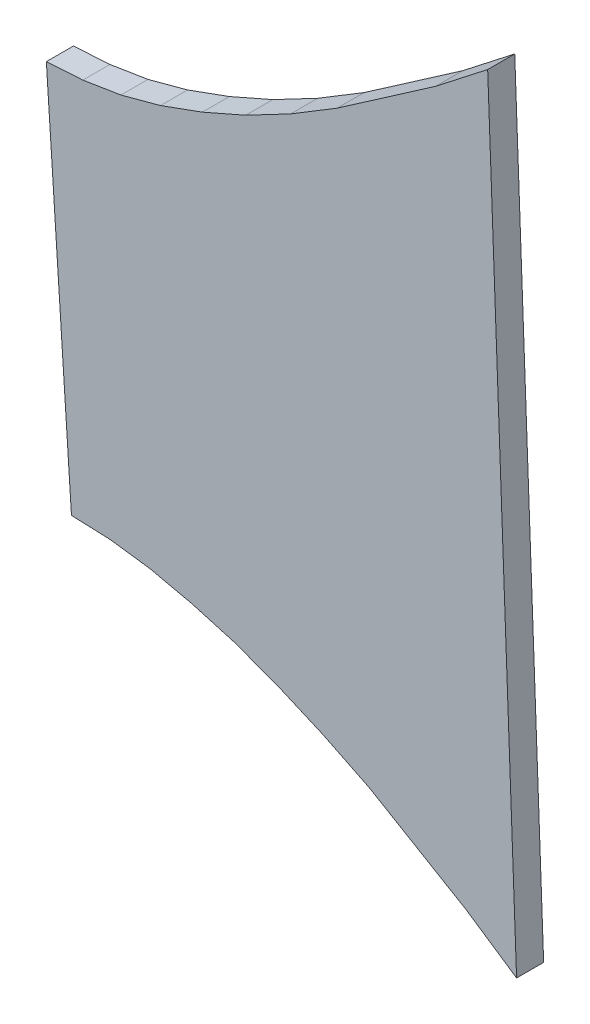
ISO-10303-21;
HEADER;
FILE_DESCRIPTION(('STEP AP214'),'2;1');
FILE_NAME('part.step','',(''),(''),'','','');
FILE_SCHEMA(('AUTOMOTIVE_DESIGN { 1 0 10303 214 1 1 1 1 }'));
ENDSEC;
DATA;
#1=APPLICATION_CONTEXT('core data for automotive mechanical design processes');
#2=APPLICATION_PROTOCOL_DEFINITION('international standard','automotive_design',2000,#1);
#3=PRODUCT_CONTEXT('',#1,'mechanical');
#4=PRODUCT('Part','Part','',(#3));
#5=PRODUCT_RELATED_PRODUCT_CATEGORY('part','',(#4));
#6=PRODUCT_DEFINITION_FORMATION('','',#4);
#7=PRODUCT_DEFINITION_CONTEXT('part definition',#1,'design');
#8=PRODUCT_DEFINITION('design','',#6,#7);
#9=PRODUCT_DEFINITION_SHAPE('','',#8);
#10=(LENGTH_UNIT() NAMED_UNIT(*) SI_UNIT(.MILLI.,.METRE.));
#11=(NAMED_UNIT(*) PLANE_ANGLE_UNIT() SI_UNIT($,.RADIAN.));
#12=(NAMED_UNIT(*) SI_UNIT($,.STERADIAN.) SOLID_ANGLE_UNIT());
#13=UNCERTAINTY_MEASURE_WITH_UNIT(LENGTH_MEASURE(1.E-05),#10,'distance_accuracy_value','');
#14=(GEOMETRIC_REPRESENTATION_CONTEXT(3) GLOBAL_UNCERTAINTY_ASSIGNED_CONTEXT((#13)) GLOBAL_UNIT_ASSIGNED_CONTEXT((#10,
#11,#12)) REPRESENTATION_CONTEXT('',''));
#15=CARTESIAN_POINT('',(0.,0.,0.));
#16=DIRECTION('',(0.,0.,1.));
#17=DIRECTION('',(1.,0.,0.));
#18=AXIS2_PLACEMENT_3D('',#15,#16,#17);
#19=CARTESIAN_POINT('',(55.9529991149902,97.7119979858398,0.));
#20=DIRECTION('',(0.0391621558048057,0.999232868531015,0.));
#21=DIRECTION('',(0.999232868531015,-0.0391621558048057,0.));
#22=AXIS2_PLACEMENT_3D('',#19,#20,#21);
#23=PLANE('',#22);
#24=DIRECTION('',(0.999232868531015,-0.0391621558048057,0.));
#25=VECTOR('',#24,1.);
#26=CARTESIAN_POINT('',(55.9529991149902,97.7119979858398,0.03556));
#27=LINE('',#26,#25);
#28=CARTESIAN_POINT('',(55.9529991149902,97.7119979858398,0.03556));
#29=VERTEX_POINT('',#28);
#30=CARTESIAN_POINT('',(56.0040016174316,97.7099990844727,0.03556));
#31=VERTEX_POINT('',#30);
#32=EDGE_CURVE('E11',#29,#31,#27,.T.);
#33=ORIENTED_EDGE('',*,*,#32,.F.);
#34=DIRECTION('',(0.,0.,1.));
#35=VECTOR('',#34,1.);
#36=CARTESIAN_POINT('',(55.9529991149902,97.7119979858398,0.));
#37=LINE('',#36,#35);
#38=CARTESIAN_POINT('',(55.9529991149902,97.7119979858398,0.));
#39=VERTEX_POINT('',#38);
#40=EDGE_CURVE('E24',#39,#29,#37,.T.);
#41=ORIENTED_EDGE('',*,*,#40,.F.);
#42=DIRECTION('',(0.999232868531015,-0.0391621558048057,0.));
#43=VECTOR('',#42,1.);
#44=CARTESIAN_POINT('',(55.9529991149902,97.7119979858398,0.));
#45=LINE('',#44,#43);
#46=CARTESIAN_POINT('',(56.0040016174316,97.7099990844727,0.));
#47=VERTEX_POINT('',#46);
#48=EDGE_CURVE('E172',#39,#47,#45,.T.);
#49=ORIENTED_EDGE('',*,*,#48,.T.);
#50=DIRECTION('',(0.,0.,1.));
#51=VECTOR('',#50,1.);
#52=CARTESIAN_POINT('',(56.0040016174316,97.7099990844727,0.));
#53=LINE('',#52,#51);
#54=EDGE_CURVE('E37',#47,#31,#53,.T.);
#55=ORIENTED_EDGE('',*,*,#54,.T.);
#56=EDGE_LOOP('',(#33,#41,#49,#55));
#57=FACE_BOUND('',#56,.T.);
#58=ADVANCED_FACE('F17',(#57),#23,.F.);
#59=CARTESIAN_POINT('',(56.0040016174317,97.7099990844727,0.));
#60=DIRECTION('',(0.133344718863295,0.991069718007401,0.));
#61=DIRECTION('',(0.991069718007401,-0.133344718863295,0.));
#62=AXIS2_PLACEMENT_3D('',#59,#60,#61);
#63=PLANE('',#62);
#64=DIRECTION('',(0.991069718007401,-0.133344718863295,0.));
#65=VECTOR('',#64,1.);
#66=CARTESIAN_POINT('',(56.0040016174316,97.7099990844727,0.03556));
#67=LINE('',#66,#65);
#68=CARTESIAN_POINT('',(56.0559997558594,97.7030029296875,0.03556));
#69=VERTEX_POINT('',#68);
#70=EDGE_CURVE('E308',#31,#69,#67,.T.);
#71=ORIENTED_EDGE('',*,*,#70,.F.);
#72=ORIENTED_EDGE('',*,*,#54,.F.);
#73=DIRECTION('',(0.991069718007401,-0.133344718863295,0.));
#74=VECTOR('',#73,1.);
#75=CARTESIAN_POINT('',(56.0040016174316,97.7099990844727,0.));
#76=LINE('',#75,#74);
#77=CARTESIAN_POINT('',(56.0559997558594,97.7030029296875,0.));
#78=VERTEX_POINT('',#77);
#79=EDGE_CURVE('E305',#47,#78,#76,.T.);
#80=ORIENTED_EDGE('',*,*,#79,.T.);
#81=DIRECTION('',(0.,0.,1.));
#82=VECTOR('',#81,1.);
#83=CARTESIAN_POINT('',(56.0559997558594,97.7030029296875,0.));
#84=LINE('',#83,#82);
#85=EDGE_CURVE('E303',#78,#69,#84,.T.);
#86=ORIENTED_EDGE('',*,*,#85,.T.);
#87=EDGE_LOOP('',(#71,#72,#80,#86));
#88=FACE_BOUND('',#87,.T.);
#89=ADVANCED_FACE('F316',(#88),#63,.F.);
#90=CARTESIAN_POINT('',(56.0559997558594,97.7030029296875,0.));
#91=DIRECTION('',(0.216945060879892,0.976183814944614,0.));
#92=DIRECTION('',(0.976183814944614,-0.216945060879892,0.));
#93=AXIS2_PLACEMENT_3D('',#90,#91,#92);
#94=PLANE('',#93);
#95=DIRECTION('',(0.976183814944614,-0.216945060879892,0.));
#96=VECTOR('',#95,1.);
#97=CARTESIAN_POINT('',(56.0559997558594,97.7030029296875,0.03556));
#98=LINE('',#97,#96);
#99=CARTESIAN_POINT('',(56.1100006103516,97.6910018920898,0.03556));
#100=VERTEX_POINT('',#99);
#101=EDGE_CURVE('E300',#69,#100,#98,.T.);
#102=ORIENTED_EDGE('',*,*,#101,.F.);
#103=ORIENTED_EDGE('',*,*,#85,.F.);
#104=DIRECTION('',(0.976183814944614,-0.216945060879892,0.));
#105=VECTOR('',#104,1.);
#106=CARTESIAN_POINT('',(56.0559997558594,97.7030029296875,0.));
#107=LINE('',#106,#105);
#108=CARTESIAN_POINT('',(56.1100006103516,97.6910018920898,0.));
#109=VERTEX_POINT('',#108);
#110=EDGE_CURVE('E297',#78,#109,#107,.T.);
#111=ORIENTED_EDGE('',*,*,#110,.T.);
#112=DIRECTION('',(0.,0.,1.));
#113=VECTOR('',#112,1.);
#114=CARTESIAN_POINT('',(56.1100006103516,97.6910018920898,0.));
#115=LINE('',#114,#113);
#116=EDGE_CURVE('E295',#109,#100,#115,.T.);
#117=ORIENTED_EDGE('',*,*,#116,.T.);
#118=EDGE_LOOP('',(#102,#103,#111,#117));
#119=FACE_BOUND('',#118,.T.);
#120=ADVANCED_FACE('F322',(#119),#94,.F.);
#121=CARTESIAN_POINT('',(56.1100006103516,97.6910018920898,0.));
#122=DIRECTION('',(0.274703826166008,0.961528890824272,0.));
#123=DIRECTION('',(0.961528890824272,-0.274703826166008,0.));
#124=AXIS2_PLACEMENT_3D('',#121,#122,#123);
#125=PLANE('',#124);
#126=DIRECTION('',(0.961528890824272,-0.274703826166008,0.));
#127=VECTOR('',#126,1.);
#128=CARTESIAN_POINT('',(56.1100006103516,97.6910018920898,0.03556));
#129=LINE('',#128,#127);
#130=CARTESIAN_POINT('',(56.1660003662109,97.6750030517578,0.03556));
#131=VERTEX_POINT('',#130);
#132=EDGE_CURVE('E292',#100,#131,#129,.T.);
#133=ORIENTED_EDGE('',*,*,#132,.F.);
#134=ORIENTED_EDGE('',*,*,#116,.F.);
#135=DIRECTION('',(0.961528890824272,-0.274703826166008,0.));
#136=VECTOR('',#135,1.);
#137=CARTESIAN_POINT('',(56.1100006103516,97.6910018920898,0.));
#138=LINE('',#137,#136);
#139=CARTESIAN_POINT('',(56.1660003662109,97.6750030517578,0.));
#140=VERTEX_POINT('',#139);
#141=EDGE_CURVE('E289',#109,#140,#138,.T.);
#142=ORIENTED_EDGE('',*,*,#141,.T.);
#143=DIRECTION('',(0.,0.,1.));
#144=VECTOR('',#143,1.);
#145=CARTESIAN_POINT('',(56.1660003662109,97.6750030517578,0.));
#146=LINE('',#145,#144);
#147=EDGE_CURVE('E287',#140,#131,#146,.T.);
#148=ORIENTED_EDGE('',*,*,#147,.T.);
#149=EDGE_LOOP('',(#133,#134,#142,#148));
#150=FACE_BOUND('',#149,.T.);
#151=ADVANCED_FACE('F324',(#150),#125,.F.);
#152=CARTESIAN_POINT('',(56.1660003662109,97.6750030517578,0.));
#153=DIRECTION('',(0.345763560811817,0.938321671930651,0.));
#154=DIRECTION('',(0.938321671930651,-0.345763560811817,0.));
#155=AXIS2_PLACEMENT_3D('',#152,#153,#154);
#156=PLANE('',#155);
#157=DIRECTION('',(0.938321671930651,-0.345763560811817,0.));
#158=VECTOR('',#157,1.);
#159=CARTESIAN_POINT('',(56.1660003662109,97.6750030517578,0.03556));
#160=LINE('',#159,#158);
#161=CARTESIAN_POINT('',(56.2229995727539,97.6539993286133,0.03556));
#162=VERTEX_POINT('',#161);
#163=EDGE_CURVE('E284',#131,#162,#160,.T.);
#164=ORIENTED_EDGE('',*,*,#163,.F.);
#165=ORIENTED_EDGE('',*,*,#147,.F.);
#166=DIRECTION('',(0.938321671930651,-0.345763560811817,0.));
#167=VECTOR('',#166,1.);
#168=CARTESIAN_POINT('',(56.1660003662109,97.6750030517578,0.));
#169=LINE('',#168,#167);
#170=CARTESIAN_POINT('',(56.2229995727539,97.6539993286133,0.));
#171=VERTEX_POINT('',#170);
#172=EDGE_CURVE('E281',#140,#171,#169,.T.);
#173=ORIENTED_EDGE('',*,*,#172,.T.);
#174=DIRECTION('',(0.,0.,1.));
#175=VECTOR('',#174,1.);
#176=CARTESIAN_POINT('',(56.2229995727539,97.6539993286133,0.));
#177=LINE('',#176,#175);
#178=EDGE_CURVE('E279',#171,#162,#177,.T.);
#179=ORIENTED_EDGE('',*,*,#178,.T.);
#180=EDGE_LOOP('',(#164,#165,#173,#179));
#181=FACE_BOUND('',#180,.T.);
#182=ADVANCED_FACE('F329',(#181),#156,.F.);
#183=CARTESIAN_POINT('',(56.2229995727539,97.6539993286133,0.));
#184=DIRECTION('',(0.397612348913037,0.917553497073526,0.));
#185=DIRECTION('',(0.917553497073526,-0.397612348913037,0.));
#186=AXIS2_PLACEMENT_3D('',#183,#184,#185);
#187=PLANE('',#186);
#188=DIRECTION('',(0.917553497073526,-0.397612348913037,0.));
#189=VECTOR('',#188,1.);
#190=CARTESIAN_POINT('',(56.2229995727539,97.6539993286133,0.03556));
#191=LINE('',#190,#189);
#192=CARTESIAN_POINT('',(56.2830009460449,97.6279983520508,0.03556));
#193=VERTEX_POINT('',#192);
#194=EDGE_CURVE('E276',#162,#193,#191,.T.);
#195=ORIENTED_EDGE('',*,*,#194,.F.);
#196=ORIENTED_EDGE('',*,*,#178,.F.);
#197=DIRECTION('',(0.917553497073526,-0.397612348913037,0.));
#198=VECTOR('',#197,1.);
#199=CARTESIAN_POINT('',(56.2229995727539,97.6539993286133,0.));
#200=LINE('',#199,#198);
#201=CARTESIAN_POINT('',(56.2830009460449,97.6279983520508,0.));
#202=VERTEX_POINT('',#201);
#203=EDGE_CURVE('E273',#171,#202,#200,.T.);
#204=ORIENTED_EDGE('',*,*,#203,.T.);
#205=DIRECTION('',(0.,0.,1.));
#206=VECTOR('',#205,1.);
#207=CARTESIAN_POINT('',(56.2830009460449,97.6279983520508,0.));
#208=LINE('',#207,#206);
#209=EDGE_CURVE('E271',#202,#193,#208,.T.);
#210=ORIENTED_EDGE('',*,*,#209,.T.);
#211=EDGE_LOOP('',(#195,#196,#204,#210));
#212=FACE_BOUND('',#211,.T.);
#213=ADVANCED_FACE('F332',(#212),#187,.F.);
#214=CARTESIAN_POINT('',(56.2830009460449,97.6279983520508,0.));
#215=DIRECTION('',(0.441300395290173,0.897359438083056,0.));
#216=DIRECTION('',(0.897359438083056,-0.441300395290173,0.));
#217=AXIS2_PLACEMENT_3D('',#214,#215,#216);
#218=PLANE('',#217);
#219=DIRECTION('',(0.897359438083056,-0.441300395290173,0.));
#220=VECTOR('',#219,1.);
#221=CARTESIAN_POINT('',(56.2830009460449,97.6279983520508,0.03556));
#222=LINE('',#221,#220);
#223=CARTESIAN_POINT('',(56.3440017700195,97.5979995727539,0.03556));
#224=VERTEX_POINT('',#223);
#225=EDGE_CURVE('E268',#193,#224,#222,.T.);
#226=ORIENTED_EDGE('',*,*,#225,.F.);
#227=ORIENTED_EDGE('',*,*,#209,.F.);
#228=DIRECTION('',(0.897359438083056,-0.441300395290173,0.));
#229=VECTOR('',#228,1.);
#230=CARTESIAN_POINT('',(56.2830009460449,97.6279983520508,0.));
#231=LINE('',#230,#229);
#232=CARTESIAN_POINT('',(56.3440017700195,97.5979995727539,0.));
#233=VERTEX_POINT('',#232);
#234=EDGE_CURVE('E265',#202,#233,#231,.T.);
#235=ORIENTED_EDGE('',*,*,#234,.T.);
#236=DIRECTION('',(0.,0.,1.));
#237=VECTOR('',#236,1.);
#238=CARTESIAN_POINT('',(56.3440017700195,97.5979995727539,0.));
#239=LINE('',#238,#237);
#240=EDGE_CURVE('E263',#233,#224,#239,.T.);
#241=ORIENTED_EDGE('',*,*,#240,.T.);
#242=EDGE_LOOP('',(#226,#227,#235,#241));
#243=FACE_BOUND('',#242,.T.);
#244=ADVANCED_FACE('F337',(#243),#218,.F.);
#245=CARTESIAN_POINT('',(56.3440017700195,97.5979995727539,0.));
#246=DIRECTION('',(0.50848879151715,0.861068608707476,0.));
#247=DIRECTION('',(0.861068608707476,-0.50848879151715,0.));
#248=AXIS2_PLACEMENT_3D('',#245,#246,#247);
#249=PLANE('',#248);
#250=DIRECTION('',(0.861068608707476,-0.50848879151715,0.));
#251=VECTOR('',#250,1.);
#252=CARTESIAN_POINT('',(56.3440017700195,97.5979995727539,0.03556));
#253=LINE('',#252,#251);
#254=CARTESIAN_POINT('',(56.4710006713867,97.5230026245117,0.03556));
#255=VERTEX_POINT('',#254);
#256=EDGE_CURVE('E260',#224,#255,#253,.T.);
#257=ORIENTED_EDGE('',*,*,#256,.F.);
#258=ORIENTED_EDGE('',*,*,#240,.F.);
#259=DIRECTION('',(0.861068608707476,-0.50848879151715,0.));
#260=VECTOR('',#259,1.);
#261=CARTESIAN_POINT('',(56.3440017700195,97.5979995727539,0.));
#262=LINE('',#261,#260);
#263=CARTESIAN_POINT('',(56.4710006713867,97.5230026245117,0.));
#264=VERTEX_POINT('',#263);
#265=EDGE_CURVE('E257',#233,#264,#262,.T.);
#266=ORIENTED_EDGE('',*,*,#265,.T.);
#267=DIRECTION('',(0.,0.,1.));
#268=VECTOR('',#267,1.);
#269=CARTESIAN_POINT('',(56.4710006713867,97.5230026245117,0.));
#270=LINE('',#269,#268);
#271=EDGE_CURVE('E255',#264,#255,#270,.T.);
#272=ORIENTED_EDGE('',*,*,#271,.T.);
#273=EDGE_LOOP('',(#257,#258,#266,#272));
#274=FACE_BOUND('',#273,.T.);
#275=ADVANCED_FACE('F340',(#274),#249,.F.);
#276=CARTESIAN_POINT('',(56.4710006713867,97.5230026245117,0.));
#277=DIRECTION('',(0.557619865544598,0.830096431476503,0.));
#278=DIRECTION('',(0.830096431476503,-0.557619865544598,0.));
#279=AXIS2_PLACEMENT_3D('',#276,#277,#278);
#280=PLANE('',#279);
#281=DIRECTION('',(0.830096431476503,-0.557619865544598,0.));
#282=VECTOR('',#281,1.);
#283=CARTESIAN_POINT('',(56.4710006713867,97.5230026245117,0.03556));
#284=LINE('',#283,#282);
#285=CARTESIAN_POINT('',(56.5379981994629,97.4779968261719,0.03556));
#286=VERTEX_POINT('',#285);
#287=EDGE_CURVE('E252',#255,#286,#284,.T.);
#288=ORIENTED_EDGE('',*,*,#287,.F.);
#289=ORIENTED_EDGE('',*,*,#271,.F.);
#290=DIRECTION('',(0.830096431476503,-0.557619865544598,0.));
#291=VECTOR('',#290,1.);
#292=CARTESIAN_POINT('',(56.4710006713867,97.5230026245117,0.));
#293=LINE('',#292,#291);
#294=CARTESIAN_POINT('',(56.5379981994629,97.4779968261719,0.));
#295=VERTEX_POINT('',#294);
#296=EDGE_CURVE('E249',#264,#295,#293,.T.);
#297=ORIENTED_EDGE('',*,*,#296,.T.);
#298=DIRECTION('',(0.,0.,1.));
#299=VECTOR('',#298,1.);
#300=CARTESIAN_POINT('',(56.5379981994629,97.4779968261719,0.));
#301=LINE('',#300,#299);
#302=EDGE_CURVE('E247',#295,#286,#301,.T.);
#303=ORIENTED_EDGE('',*,*,#302,.T.);
#304=EDGE_LOOP('',(#288,#289,#297,#303));
#305=FACE_BOUND('',#304,.T.);
#306=ADVANCED_FACE('F345',(#305),#280,.F.);
#307=CARTESIAN_POINT('',(56.5379981994629,97.4779968261719,0.));
#308=DIRECTION('',(-0.999299983507494,-0.0374104659410024,0.));
#309=DIRECTION('',(-0.0374104659410024,0.999299983507494,0.));
#310=AXIS2_PLACEMENT_3D('',#307,#308,#309);
#311=PLANE('',#310);
#312=DIRECTION('',(-0.0374104659410024,0.999299983507494,0.));
#313=VECTOR('',#312,1.);
#314=CARTESIAN_POINT('',(56.5379981994629,97.4779968261719,0.03556));
#315=LINE('',#314,#313);
#316=CARTESIAN_POINT('',(56.5,98.4929962158203,0.03556));
#317=VERTEX_POINT('',#316);
#318=EDGE_CURVE('E244',#286,#317,#315,.T.);
#319=ORIENTED_EDGE('',*,*,#318,.F.);
#320=ORIENTED_EDGE('',*,*,#302,.F.);
#321=DIRECTION('',(-0.0374104659410024,0.999299983507494,0.));
#322=VECTOR('',#321,1.);
#323=CARTESIAN_POINT('',(56.5379981994629,97.4779968261719,0.));
#324=LINE('',#323,#322);
#325=CARTESIAN_POINT('',(56.5,98.4929962158203,0.));
#326=VERTEX_POINT('',#325);
#327=EDGE_CURVE('E241',#295,#326,#324,.T.);
#328=ORIENTED_EDGE('',*,*,#327,.T.);
#329=DIRECTION('',(0.,0.,1.));
#330=VECTOR('',#329,1.);
#331=CARTESIAN_POINT('',(56.5,98.4929962158203,0.));
#332=LINE('',#331,#330);
#333=EDGE_CURVE('E239',#326,#317,#332,.T.);
#334=ORIENTED_EDGE('',*,*,#333,.T.);
#335=EDGE_LOOP('',(#319,#320,#328,#334));
#336=FACE_BOUND('',#335,.T.);
#337=ADVANCED_FACE('F348',(#336),#311,.F.);
#338=CARTESIAN_POINT('',(56.5,98.4929962158203,0.));
#339=DIRECTION('',(0.614693912068443,-0.788765741184284,0.));
#340=DIRECTION('',(-0.788765741184284,-0.614693912068443,0.));
#341=AXIS2_PLACEMENT_3D('',#338,#339,#340);
#342=PLANE('',#341);
#343=DIRECTION('',(-0.788765741184284,-0.614693912068443,0.));
#344=VECTOR('',#343,1.);
#345=CARTESIAN_POINT('',(56.5,98.4929962158203,0.03556));
#346=LINE('',#345,#344);
#347=CARTESIAN_POINT('',(56.431999206543,98.4400024414062,0.03556));
#348=VERTEX_POINT('',#347);
#349=EDGE_CURVE('E236',#317,#348,#346,.T.);
#350=ORIENTED_EDGE('',*,*,#349,.F.);
#351=ORIENTED_EDGE('',*,*,#333,.F.);
#352=DIRECTION('',(-0.788765741184284,-0.614693912068443,0.));
#353=VECTOR('',#352,1.);
#354=CARTESIAN_POINT('',(56.5,98.4929962158203,0.));
#355=LINE('',#354,#353);
#356=CARTESIAN_POINT('',(56.431999206543,98.4400024414062,0.));
#357=VERTEX_POINT('',#356);
#358=EDGE_CURVE('E233',#326,#357,#355,.T.);
#359=ORIENTED_EDGE('',*,*,#358,.T.);
#360=DIRECTION('',(0.,0.,1.));
#361=VECTOR('',#360,1.);
#362=CARTESIAN_POINT('',(56.431999206543,98.4400024414062,0.));
#363=LINE('',#362,#361);
#364=EDGE_CURVE('E231',#357,#348,#363,.T.);
#365=ORIENTED_EDGE('',*,*,#364,.T.);
#366=EDGE_LOOP('',(#350,#351,#359,#365));
#367=FACE_BOUND('',#366,.T.);
#368=ADVANCED_FACE('F353',(#367),#342,.F.);
#369=CARTESIAN_POINT('',(56.431999206543,98.4400024414063,0.));
#370=DIRECTION('',(0.569223778699331,-0.822182637716983,0.));
#371=DIRECTION('',(-0.822182637716983,-0.569223778699331,0.));
#372=AXIS2_PLACEMENT_3D('',#369,#370,#371);
#373=PLANE('',#372);
#374=DIRECTION('',(-0.822182637716983,-0.569223778699331,0.));
#375=VECTOR('',#374,1.);
#376=CARTESIAN_POINT('',(56.431999206543,98.4400024414062,0.03556));
#377=LINE('',#376,#375);
#378=CARTESIAN_POINT('',(56.3019981384277,98.3499984741211,0.03556));
#379=VERTEX_POINT('',#378);
#380=EDGE_CURVE('E228',#348,#379,#377,.T.);
#381=ORIENTED_EDGE('',*,*,#380,.F.);
#382=ORIENTED_EDGE('',*,*,#364,.F.);
#383=DIRECTION('',(-0.822182637716983,-0.569223778699331,0.));
#384=VECTOR('',#383,1.);
#385=CARTESIAN_POINT('',(56.431999206543,98.4400024414062,0.));
#386=LINE('',#385,#384);
#387=CARTESIAN_POINT('',(56.3019981384277,98.3499984741211,0.));
#388=VERTEX_POINT('',#387);
#389=EDGE_CURVE('E225',#357,#388,#386,.T.);
#390=ORIENTED_EDGE('',*,*,#389,.T.);
#391=DIRECTION('',(0.,0.,1.));
#392=VECTOR('',#391,1.);
#393=CARTESIAN_POINT('',(56.3019981384277,98.3499984741211,0.));
#394=LINE('',#393,#392);
#395=EDGE_CURVE('E223',#388,#379,#394,.T.);
#396=ORIENTED_EDGE('',*,*,#395,.T.);
#397=EDGE_LOOP('',(#381,#382,#390,#396));
#398=FACE_BOUND('',#397,.T.);
#399=ADVANCED_FACE('F356',(#398),#373,.F.);
#400=CARTESIAN_POINT('',(56.3019981384277,98.3499984741211,0.));
#401=DIRECTION('',(0.518579000322324,-0.855029719030105,0.));
#402=DIRECTION('',(-0.855029719030105,-0.518579000322324,0.));
#403=AXIS2_PLACEMENT_3D('',#400,#401,#402);
#404=PLANE('',#403);
#405=DIRECTION('',(-0.855029719030104,-0.518579000322324,0.));
#406=VECTOR('',#405,1.);
#407=CARTESIAN_POINT('',(56.3019981384277,98.3499984741211,0.03556));
#408=LINE('',#407,#406);
#409=CARTESIAN_POINT('',(56.2410011291504,98.3130035400391,0.03556));
#410=VERTEX_POINT('',#409);
#411=EDGE_CURVE('E220',#379,#410,#408,.T.);
#412=ORIENTED_EDGE('',*,*,#411,.F.);
#413=ORIENTED_EDGE('',*,*,#395,.F.);
#414=DIRECTION('',(-0.855029719030104,-0.518579000322324,0.));
#415=VECTOR('',#414,1.);
#416=CARTESIAN_POINT('',(56.3019981384277,98.3499984741211,0.));
#417=LINE('',#416,#415);
#418=CARTESIAN_POINT('',(56.2410011291504,98.3130035400391,0.));
#419=VERTEX_POINT('',#418);
#420=EDGE_CURVE('E217',#388,#419,#417,.T.);
#421=ORIENTED_EDGE('',*,*,#420,.T.);
#422=DIRECTION('',(0.,0.,1.));
#423=VECTOR('',#422,1.);
#424=CARTESIAN_POINT('',(56.2410011291504,98.3130035400391,0.));
#425=LINE('',#424,#423);
#426=EDGE_CURVE('E215',#419,#410,#425,.T.);
#427=ORIENTED_EDGE('',*,*,#426,.T.);
#428=EDGE_LOOP('',(#412,#413,#421,#427));
#429=FACE_BOUND('',#428,.T.);
#430=ADVANCED_FACE('F361',(#429),#404,.F.);
#431=CARTESIAN_POINT('',(56.2410011291504,98.3130035400391,0.));
#432=DIRECTION('',(0.465184940172714,-0.88521351742758,0.));
#433=DIRECTION('',(-0.88521351742758,-0.465184940172714,0.));
#434=AXIS2_PLACEMENT_3D('',#431,#432,#433);
#435=PLANE('',#434);
#436=DIRECTION('',(-0.88521351742758,-0.465184940172714,0.));
#437=VECTOR('',#436,1.);
#438=CARTESIAN_POINT('',(56.2410011291504,98.3130035400391,0.03556));
#439=LINE('',#438,#437);
#440=CARTESIAN_POINT('',(56.181999206543,98.2819976806641,0.03556));
#441=VERTEX_POINT('',#440);
#442=EDGE_CURVE('E212',#410,#441,#439,.T.);
#443=ORIENTED_EDGE('',*,*,#442,.F.);
#444=ORIENTED_EDGE('',*,*,#426,.F.);
#445=DIRECTION('',(-0.88521351742758,-0.465184940172714,0.));
#446=VECTOR('',#445,1.);
#447=CARTESIAN_POINT('',(56.2410011291504,98.3130035400391,0.));
#448=LINE('',#447,#446);
#449=CARTESIAN_POINT('',(56.181999206543,98.2819976806641,0.));
#450=VERTEX_POINT('',#449);
#451=EDGE_CURVE('E209',#419,#450,#448,.T.);
#452=ORIENTED_EDGE('',*,*,#451,.T.);
#453=DIRECTION('',(0.,0.,1.));
#454=VECTOR('',#453,1.);
#455=CARTESIAN_POINT('',(56.181999206543,98.2819976806641,0.));
#456=LINE('',#455,#454);
#457=EDGE_CURVE('E207',#450,#441,#456,.T.);
#458=ORIENTED_EDGE('',*,*,#457,.T.);
#459=EDGE_LOOP('',(#443,#444,#452,#458));
#460=FACE_BOUND('',#459,.T.);
#461=ADVANCED_FACE('F364',(#460),#435,.F.);
#462=CARTESIAN_POINT('',(56.181999206543,98.2819976806641,0.));
#463=DIRECTION('',(0.401583937513721,-0.91582222135684,0.));
#464=DIRECTION('',(-0.91582222135684,-0.401583937513721,0.));
#465=AXIS2_PLACEMENT_3D('',#462,#463,#464);
#466=PLANE('',#465);
#467=DIRECTION('',(-0.91582222135684,-0.401583937513721,0.));
#468=VECTOR('',#467,1.);
#469=CARTESIAN_POINT('',(56.181999206543,98.2819976806641,0.03556));
#470=LINE('',#469,#468);
#471=CARTESIAN_POINT('',(56.125,98.2570037841797,0.03556));
#472=VERTEX_POINT('',#471);
#473=EDGE_CURVE('E204',#441,#472,#470,.T.);
#474=ORIENTED_EDGE('',*,*,#473,.F.);
#475=ORIENTED_EDGE('',*,*,#457,.F.);
#476=DIRECTION('',(-0.91582222135684,-0.401583937513721,0.));
#477=VECTOR('',#476,1.);
#478=CARTESIAN_POINT('',(56.181999206543,98.2819976806641,0.));
#479=LINE('',#478,#477);
#480=CARTESIAN_POINT('',(56.125,98.2570037841797,0.));
#481=VERTEX_POINT('',#480);
#482=EDGE_CURVE('E201',#450,#481,#479,.T.);
#483=ORIENTED_EDGE('',*,*,#482,.T.);
#484=DIRECTION('',(0.,0.,1.));
#485=VECTOR('',#484,1.);
#486=CARTESIAN_POINT('',(56.125,98.2570037841797,0.));
#487=LINE('',#486,#485);
#488=EDGE_CURVE('E199',#481,#472,#487,.T.);
#489=ORIENTED_EDGE('',*,*,#488,.T.);
#490=EDGE_LOOP('',(#474,#475,#483,#489));
#491=FACE_BOUND('',#490,.T.);
#492=ADVANCED_FACE('F369',(#491),#466,.F.);
#493=CARTESIAN_POINT('',(56.125,98.2570037841797,0.));
#494=DIRECTION('',(0.341805863848703,-0.939770584471892,0.));
#495=DIRECTION('',(-0.939770584471892,-0.341805863848703,0.));
#496=AXIS2_PLACEMENT_3D('',#493,#494,#495);
#497=PLANE('',#496);
#498=DIRECTION('',(-0.939770584471892,-0.341805863848703,0.));
#499=VECTOR('',#498,1.);
#500=CARTESIAN_POINT('',(56.125,98.2570037841797,0.03556));
#501=LINE('',#500,#499);
#502=CARTESIAN_POINT('',(56.0699996948242,98.2369995117188,0.03556));
#503=VERTEX_POINT('',#502);
#504=EDGE_CURVE('E196',#472,#503,#501,.T.);
#505=ORIENTED_EDGE('',*,*,#504,.F.);
#506=ORIENTED_EDGE('',*,*,#488,.F.);
#507=DIRECTION('',(-0.939770584471892,-0.341805863848703,0.));
#508=VECTOR('',#507,1.);
#509=CARTESIAN_POINT('',(56.125,98.2570037841797,0.));
#510=LINE('',#509,#508);
#511=CARTESIAN_POINT('',(56.0699996948242,98.2369995117188,0.));
#512=VERTEX_POINT('',#511);
#513=EDGE_CURVE('E193',#481,#512,#510,.T.);
#514=ORIENTED_EDGE('',*,*,#513,.T.);
#515=DIRECTION('',(0.,0.,1.));
#516=VECTOR('',#515,1.);
#517=CARTESIAN_POINT('',(56.0699996948242,98.2369995117188,0.));
#518=LINE('',#517,#516);
#519=EDGE_CURVE('E191',#512,#503,#518,.T.);
#520=ORIENTED_EDGE('',*,*,#519,.T.);
#521=EDGE_LOOP('',(#505,#506,#514,#520));
#522=FACE_BOUND('',#521,.T.);
#523=ADVANCED_FACE('F372',(#522),#497,.F.);
#524=CARTESIAN_POINT('',(56.0699996948242,98.2369995117188,0.));
#525=DIRECTION('',(0.259981094796684,-0.96561370658681,0.));
#526=DIRECTION('',(-0.96561370658681,-0.259981094796684,0.));
#527=AXIS2_PLACEMENT_3D('',#524,#525,#526);
#528=PLANE('',#527);
#529=DIRECTION('',(-0.96561370658681,-0.259981094796684,0.));
#530=VECTOR('',#529,1.);
#531=CARTESIAN_POINT('',(56.0699996948242,98.2369995117188,0.03556));
#532=LINE('',#531,#530);
#533=CARTESIAN_POINT('',(56.0180015563965,98.2229995727539,0.03556));
#534=VERTEX_POINT('',#533);
#535=EDGE_CURVE('E188',#503,#534,#532,.T.);
#536=ORIENTED_EDGE('',*,*,#535,.F.);
#537=ORIENTED_EDGE('',*,*,#519,.F.);
#538=DIRECTION('',(-0.96561370658681,-0.259981094796684,0.));
#539=VECTOR('',#538,1.);
#540=CARTESIAN_POINT('',(56.0699996948242,98.2369995117188,0.));
#541=LINE('',#540,#539);
#542=CARTESIAN_POINT('',(56.0180015563965,98.2229995727539,0.));
#543=VERTEX_POINT('',#542);
#544=EDGE_CURVE('E185',#512,#543,#541,.T.);
#545=ORIENTED_EDGE('',*,*,#544,.T.);
#546=DIRECTION('',(0.,0.,1.));
#547=VECTOR('',#546,1.);
#548=CARTESIAN_POINT('',(56.0180015563965,98.2229995727539,0.));
#549=LINE('',#548,#547);
#550=EDGE_CURVE('E183',#543,#534,#549,.T.);
#551=ORIENTED_EDGE('',*,*,#550,.T.);
#552=EDGE_LOOP('',(#536,#537,#545,#551));
#553=FACE_BOUND('',#552,.T.);
#554=ADVANCED_FACE('F377',(#553),#528,.F.);
#555=CARTESIAN_POINT('',(56.0180015563965,98.2229995727539,0.));
#556=DIRECTION('',(0.158043385005117,-0.98743216904055,0.));
#557=DIRECTION('',(-0.98743216904055,-0.158043385005117,0.));
#558=AXIS2_PLACEMENT_3D('',#555,#556,#557);
#559=PLANE('',#558);
#560=DIRECTION('',(-0.98743216904055,-0.158043385005117,0.));
#561=VECTOR('',#560,1.);
#562=CARTESIAN_POINT('',(56.0180015563965,98.2229995727539,0.03556));
#563=LINE('',#562,#561);
#564=CARTESIAN_POINT('',(55.9679985046387,98.2149963378906,0.03556));
#565=VERTEX_POINT('',#564);
#566=EDGE_CURVE('E180',#534,#565,#563,.T.);
#567=ORIENTED_EDGE('',*,*,#566,.F.);
#568=ORIENTED_EDGE('',*,*,#550,.F.);
#569=DIRECTION('',(-0.98743216904055,-0.158043385005117,0.));
#570=VECTOR('',#569,1.);
#571=CARTESIAN_POINT('',(56.0180015563965,98.2229995727539,0.));
#572=LINE('',#571,#570);
#573=CARTESIAN_POINT('',(55.9679985046387,98.2149963378906,0.));
#574=VERTEX_POINT('',#573);
#575=EDGE_CURVE('E178',#543,#574,#572,.T.);
#576=ORIENTED_EDGE('',*,*,#575,.T.);
#577=DIRECTION('',(0.,0.,1.));
#578=VECTOR('',#577,1.);
#579=CARTESIAN_POINT('',(55.9679985046387,98.2149963378906,0.));
#580=LINE('',#579,#578);
#581=EDGE_CURVE('E163',#574,#565,#580,.T.);
#582=ORIENTED_EDGE('',*,*,#581,.T.);
#583=EDGE_LOOP('',(#567,#568,#576,#582));
#584=FACE_BOUND('',#583,.T.);
#585=ADVANCED_FACE('F379',(#584),#559,.F.);
#586=CARTESIAN_POINT('',(55.9679985046387,98.2149963378906,0.));
#587=DIRECTION('',(0.0623437196451584,-0.998054738288841,0.));
#588=DIRECTION('',(-0.998054738288841,-0.0623437196451584,0.));
#589=AXIS2_PLACEMENT_3D('',#586,#587,#588);
#590=PLANE('',#589);
#591=DIRECTION('',(-0.998054738288841,-0.0623437196451584,0.));
#592=VECTOR('',#591,1.);
#593=CARTESIAN_POINT('',(55.9679985046387,98.2149963378906,0.03556));
#594=LINE('',#593,#592);
#595=CARTESIAN_POINT('',(55.9199981689453,98.2119979858398,0.03556));
#596=VERTEX_POINT('',#595);
#597=EDGE_CURVE('E167',#565,#596,#594,.T.);
#598=ORIENTED_EDGE('',*,*,#597,.F.);
#599=ORIENTED_EDGE('',*,*,#581,.F.);
#600=DIRECTION('',(-0.998054738288841,-0.0623437196451584,0.));
#601=VECTOR('',#600,1.);
#602=CARTESIAN_POINT('',(55.9679985046387,98.2149963378906,0.));
#603=LINE('',#602,#601);
#604=CARTESIAN_POINT('',(55.9199981689453,98.2119979858398,0.));
#605=VERTEX_POINT('',#604);
#606=EDGE_CURVE('E159',#574,#605,#603,.T.);
#607=ORIENTED_EDGE('',*,*,#606,.T.);
#608=DIRECTION('',(0.,0.,1.));
#609=VECTOR('',#608,1.);
#610=CARTESIAN_POINT('',(55.9199981689453,98.2119979858398,0.));
#611=LINE('',#610,#609);
#612=EDGE_CURVE('E149',#605,#596,#611,.T.);
#613=ORIENTED_EDGE('',*,*,#612,.T.);
#614=EDGE_LOOP('',(#598,#599,#607,#613));
#615=FACE_BOUND('',#614,.T.);
#616=ADVANCED_FACE('F162',(#615),#590,.F.);
#617=CARTESIAN_POINT('',(55.9199981689453,98.2119979858398,0.));
#618=DIRECTION('',(0.997828965726552,0.0658585997200043,0.));
#619=DIRECTION('',(0.0658585997200043,-0.997828965726552,0.));
#620=AXIS2_PLACEMENT_3D('',#617,#618,#619);
#621=PLANE('',#620);
#622=DIRECTION('',(0.0658585997200043,-0.997828965726552,0.));
#623=VECTOR('',#622,1.);
#624=CARTESIAN_POINT('',(55.9199981689453,98.2119979858398,0.03556));
#625=LINE('',#624,#623);
#626=EDGE_CURVE('E155',#596,#29,#625,.T.);
#627=ORIENTED_EDGE('',*,*,#626,.F.);
#628=ORIENTED_EDGE('',*,*,#612,.F.);
#629=DIRECTION('',(0.0658585997200043,-0.997828965726552,0.));
#630=VECTOR('',#629,1.);
#631=CARTESIAN_POINT('',(55.9199981689453,98.2119979858398,0.));
#632=LINE('',#631,#630);
#633=EDGE_CURVE('E153',#605,#39,#632,.T.);
#634=ORIENTED_EDGE('',*,*,#633,.T.);
#635=ORIENTED_EDGE('',*,*,#40,.T.);
#636=EDGE_LOOP('',(#627,#628,#634,#635));
#637=FACE_BOUND('',#636,.T.);
#638=ADVANCED_FACE('F151',(#637),#621,.F.);
#639=CARTESIAN_POINT('',(55.9529991149902,97.7119979858398,0.));
#640=DIRECTION('',(0.,0.,1.));
#641=DIRECTION('',(1.,0.,0.));
#642=AXIS2_PLACEMENT_3D('',#639,#640,#641);
#643=PLANE('',#642);
#644=ORIENTED_EDGE('',*,*,#633,.F.);
#645=ORIENTED_EDGE('',*,*,#606,.F.);
#646=ORIENTED_EDGE('',*,*,#575,.F.);
#647=ORIENTED_EDGE('',*,*,#544,.F.);
#648=ORIENTED_EDGE('',*,*,#513,.F.);
#649=ORIENTED_EDGE('',*,*,#482,.F.);
#650=ORIENTED_EDGE('',*,*,#451,.F.);
#651=ORIENTED_EDGE('',*,*,#420,.F.);
#652=ORIENTED_EDGE('',*,*,#389,.F.);
#653=ORIENTED_EDGE('',*,*,#358,.F.);
#654=ORIENTED_EDGE('',*,*,#327,.F.);
#655=ORIENTED_EDGE('',*,*,#296,.F.);
#656=ORIENTED_EDGE('',*,*,#265,.F.);
#657=ORIENTED_EDGE('',*,*,#234,.F.);
#658=ORIENTED_EDGE('',*,*,#203,.F.);
#659=ORIENTED_EDGE('',*,*,#172,.F.);
#660=ORIENTED_EDGE('',*,*,#141,.F.);
#661=ORIENTED_EDGE('',*,*,#110,.F.);
#662=ORIENTED_EDGE('',*,*,#79,.F.);
#663=ORIENTED_EDGE('',*,*,#48,.F.);
#664=EDGE_LOOP('',(#644,#645,#646,#647,#648,#649,#650,#651,#652,#653,#654,#655,#656,#657,#658,
#659,#660,#661,#662,#663));
#665=FACE_BOUND('',#664,.T.);
#666=ADVANCED_FACE('F170',(#665),#643,.F.);
#667=CARTESIAN_POINT('',(55.9529991149902,97.7119979858398,0.03556));
#668=DIRECTION('',(0.,0.,1.));
#669=DIRECTION('',(1.,0.,0.));
#670=AXIS2_PLACEMENT_3D('',#667,#668,#669);
#671=PLANE('',#670);
#672=ORIENTED_EDGE('',*,*,#32,.T.);
#673=ORIENTED_EDGE('',*,*,#70,.T.);
#674=ORIENTED_EDGE('',*,*,#101,.T.);
#675=ORIENTED_EDGE('',*,*,#132,.T.);
#676=ORIENTED_EDGE('',*,*,#163,.T.);
#677=ORIENTED_EDGE('',*,*,#194,.T.);
#678=ORIENTED_EDGE('',*,*,#225,.T.);
#679=ORIENTED_EDGE('',*,*,#256,.T.);
#680=ORIENTED_EDGE('',*,*,#287,.T.);
#681=ORIENTED_EDGE('',*,*,#318,.T.);
#682=ORIENTED_EDGE('',*,*,#349,.T.);
#683=ORIENTED_EDGE('',*,*,#380,.T.);
#684=ORIENTED_EDGE('',*,*,#411,.T.);
#685=ORIENTED_EDGE('',*,*,#442,.T.);
#686=ORIENTED_EDGE('',*,*,#473,.T.);
#687=ORIENTED_EDGE('',*,*,#504,.T.);
#688=ORIENTED_EDGE('',*,*,#535,.T.);
#689=ORIENTED_EDGE('',*,*,#566,.T.);
#690=ORIENTED_EDGE('',*,*,#597,.T.);
#691=ORIENTED_EDGE('',*,*,#626,.T.);
#692=EDGE_LOOP('',(#672,#673,#674,#675,#676,#677,#678,#679,#680,#681,#682,#683,#684,#685,#686,
#687,#688,#689,#690,#691));
#693=FACE_BOUND('',#692,.T.);
#694=ADVANCED_FACE('F319',(#693),#671,.T.);
#695=CLOSED_SHELL('',(#58,#89,#120,#151,#182,#213,#244,#275,#306,#337,#368,#399,#430,#461,#492,
#523,#554,#585,#616,#638,#666,#694));
#696=MANIFOLD_SOLID_BREP('B1',#695);
#697=ADVANCED_BREP_SHAPE_REPRESENTATION('',(#18,#696),#14);
#698=SHAPE_DEFINITION_REPRESENTATION(#9,#697);
ENDSEC;
END-ISO-10303-21;
